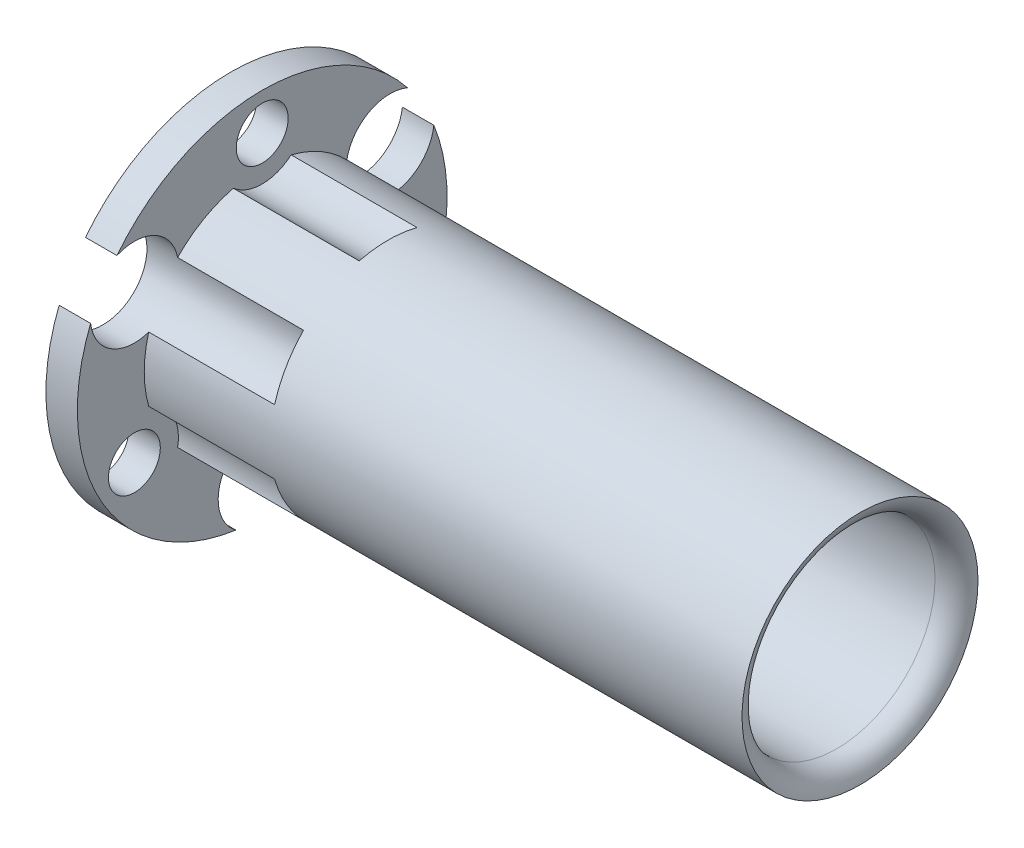
ISO-10303-21;
HEADER;
FILE_DESCRIPTION(('STEP AP214'),'2;1');
FILE_NAME('part.step','',(''),(''),'','','');
FILE_SCHEMA(('AUTOMOTIVE_DESIGN { 1 0 10303 214 1 1 1 1 }'));
ENDSEC;
DATA;
#1=APPLICATION_CONTEXT('core data for automotive mechanical design processes');
#2=APPLICATION_PROTOCOL_DEFINITION('international standard','automotive_design',2000,#1);
#3=PRODUCT_CONTEXT('',#1,'mechanical');
#4=PRODUCT('Part','Part','',(#3));
#5=PRODUCT_RELATED_PRODUCT_CATEGORY('part','',(#4));
#6=PRODUCT_DEFINITION_FORMATION('','',#4);
#7=PRODUCT_DEFINITION_CONTEXT('part definition',#1,'design');
#8=PRODUCT_DEFINITION('design','',#6,#7);
#9=PRODUCT_DEFINITION_SHAPE('','',#8);
#10=(LENGTH_UNIT() NAMED_UNIT(*) SI_UNIT(.MILLI.,.METRE.));
#11=(NAMED_UNIT(*) PLANE_ANGLE_UNIT() SI_UNIT($,.RADIAN.));
#12=(NAMED_UNIT(*) SI_UNIT($,.STERADIAN.) SOLID_ANGLE_UNIT());
#13=UNCERTAINTY_MEASURE_WITH_UNIT(LENGTH_MEASURE(1.E-05),#10,'distance_accuracy_value','');
#14=(GEOMETRIC_REPRESENTATION_CONTEXT(3) GLOBAL_UNCERTAINTY_ASSIGNED_CONTEXT((#13)) GLOBAL_UNIT_ASSIGNED_CONTEXT((#10,
#11,#12)) REPRESENTATION_CONTEXT('',''));
#15=CARTESIAN_POINT('',(0.,0.,0.));
#16=DIRECTION('',(0.,0.,1.));
#17=DIRECTION('',(1.,0.,0.));
#18=AXIS2_PLACEMENT_3D('',#15,#16,#17);
#19=CARTESIAN_POINT('',(2.,0.,0.));
#20=DIRECTION('',(-1.,0.,0.));
#21=DIRECTION('',(0.,0.,1.));
#22=AXIS2_PLACEMENT_3D('',#19,#20,#21);
#23=CYLINDRICAL_SURFACE('',#22,7.5);
#24=CARTESIAN_POINT('',(40.,0.,0.));
#25=DIRECTION('',(1.,0.,0.));
#26=DIRECTION('',(0.,0.,-1.));
#27=AXIS2_PLACEMENT_3D('',#24,#25,#26);
#28=CIRCLE('',#27,7.5);
#29=CARTESIAN_POINT('',(40.,0.,-7.5));
#30=VERTEX_POINT('',#29);
#31=EDGE_CURVE('E265',#30,#30,#28,.T.);
#32=ORIENTED_EDGE('',*,*,#31,.F.);
#33=EDGE_LOOP('',(#32));
#34=FACE_BOUND('',#33,.T.);
#35=DIRECTION('',(-1.,0.,0.));
#36=VECTOR('',#35,1.);
#37=CARTESIAN_POINT('',(6.,-7.27161561001598,1.83673798353818));
#38=LINE('',#37,#36);
#39=CARTESIAN_POINT('',(10.,-7.27161561001598,1.83673798353818));
#40=VERTEX_POINT('',#39);
#41=CARTESIAN_POINT('',(2.,-7.27161561001598,1.83673798353818));
#42=VERTEX_POINT('',#41);
#43=EDGE_CURVE('E171',#40,#42,#38,.T.);
#44=ORIENTED_EDGE('',*,*,#43,.F.);
#45=CARTESIAN_POINT('',(10.,0.,0.));
#46=DIRECTION('',(1.,0.,0.));
#47=DIRECTION('',(0.,0.,-1.));
#48=AXIS2_PLACEMENT_3D('',#45,#46,#47);
#49=CIRCLE('',#48,7.5);
#50=CARTESIAN_POINT('',(10.,-7.27161561001598,-1.83673798353818));
#51=VERTEX_POINT('',#50);
#52=EDGE_CURVE('E51',#40,#51,#49,.T.);
#53=ORIENTED_EDGE('',*,*,#52,.T.);
#54=DIRECTION('',(-1.,0.,0.));
#55=VECTOR('',#54,1.);
#56=CARTESIAN_POINT('',(6.,-7.27161561001598,-1.83673798353818));
#57=LINE('',#56,#55);
#58=CARTESIAN_POINT('',(2.,-7.27161561001598,-1.83673798353818));
#59=VERTEX_POINT('',#58);
#60=EDGE_CURVE('E182',#59,#51,#57,.F.);
#61=ORIENTED_EDGE('',*,*,#60,.F.);
#62=CARTESIAN_POINT('',(2.,0.,0.));
#63=DIRECTION('',(1.,0.,0.));
#64=DIRECTION('',(0.,0.,-1.));
#65=AXIS2_PLACEMENT_3D('',#62,#63,#64);
#66=CIRCLE('',#65,7.5);
#67=CARTESIAN_POINT('',(2.,-5.22646955884792,-5.37903485306017));
#68=VERTEX_POINT('',#67);
#69=EDGE_CURVE('E269',#68,#59,#66,.F.);
#70=ORIENTED_EDGE('',*,*,#69,.F.);
#71=DIRECTION('',(-1.,0.,0.));
#72=VECTOR('',#71,1.);
#73=CARTESIAN_POINT('',(10.,-5.22646955884792,-5.37903485306017));
#74=LINE('',#73,#72);
#75=CARTESIAN_POINT('',(10.,-5.22646955884792,-5.37903485306017));
#76=VERTEX_POINT('',#75);
#77=EDGE_CURVE('E290',#76,#68,#74,.T.);
#78=ORIENTED_EDGE('',*,*,#77,.F.);
#79=CARTESIAN_POINT('',(10.,0.,0.));
#80=DIRECTION('',(1.,0.,0.));
#81=DIRECTION('',(0.,0.,-1.));
#82=AXIS2_PLACEMENT_3D('',#79,#80,#81);
#83=CIRCLE('',#82,7.5);
#84=CARTESIAN_POINT('',(10.,-2.04514605116821,-7.21577283659838));
#85=VERTEX_POINT('',#84);
#86=EDGE_CURVE('E295',#76,#85,#83,.T.);
#87=ORIENTED_EDGE('',*,*,#86,.T.);
#88=DIRECTION('',(-1.,0.,0.));
#89=VECTOR('',#88,1.);
#90=CARTESIAN_POINT('',(10.,-2.04514605116821,-7.21577283659838));
#91=LINE('',#90,#89);
#92=CARTESIAN_POINT('',(2.,-2.04514605116821,-7.21577283659838));
#93=VERTEX_POINT('',#92);
#94=EDGE_CURVE('E298',#85,#93,#91,.T.);
#95=ORIENTED_EDGE('',*,*,#94,.T.);
#96=CARTESIAN_POINT('',(2.,2.04514605116806,-7.21577283659843));
#97=VERTEX_POINT('',#96);
#98=EDGE_CURVE('E325',#97,#93,#66,.F.);
#99=ORIENTED_EDGE('',*,*,#98,.F.);
#100=DIRECTION('',(-1.,0.,0.));
#101=VECTOR('',#100,1.);
#102=CARTESIAN_POINT('',(10.,2.04514605116806,-7.21577283659843));
#103=LINE('',#102,#101);
#104=CARTESIAN_POINT('',(10.,2.04514605116806,-7.21577283659843));
#105=VERTEX_POINT('',#104);
#106=EDGE_CURVE('E300',#105,#97,#103,.T.);
#107=ORIENTED_EDGE('',*,*,#106,.F.);
#108=CARTESIAN_POINT('',(10.,0.,0.));
#109=DIRECTION('',(1.,0.,0.));
#110=DIRECTION('',(0.,0.,-1.));
#111=AXIS2_PLACEMENT_3D('',#108,#109,#110);
#112=CIRCLE('',#111,7.5);
#113=CARTESIAN_POINT('',(10.,5.22646955884781,-5.37903485306028));
#114=VERTEX_POINT('',#113);
#115=EDGE_CURVE('E307',#105,#114,#112,.T.);
#116=ORIENTED_EDGE('',*,*,#115,.T.);
#117=DIRECTION('',(-1.,0.,0.));
#118=VECTOR('',#117,1.);
#119=CARTESIAN_POINT('',(10.,5.22646955884781,-5.37903485306028));
#120=LINE('',#119,#118);
#121=CARTESIAN_POINT('',(2.,5.22646955884781,-5.37903485306028));
#122=VERTEX_POINT('',#121);
#123=EDGE_CURVE('E311',#114,#122,#120,.T.);
#124=ORIENTED_EDGE('',*,*,#123,.T.);
#125=CARTESIAN_POINT('',(2.,7.27161561001597,-1.83673798353823));
#126=VERTEX_POINT('',#125);
#127=EDGE_CURVE('E192',#126,#122,#66,.F.);
#128=ORIENTED_EDGE('',*,*,#127,.F.);
#129=DIRECTION('',(-1.,0.,0.));
#130=VECTOR('',#129,1.);
#131=CARTESIAN_POINT('',(10.,7.27161561001597,-1.83673798353823));
#132=LINE('',#131,#130);
#133=CARTESIAN_POINT('',(10.,7.27161561001597,-1.83673798353823));
#134=VERTEX_POINT('',#133);
#135=EDGE_CURVE('E308',#134,#126,#132,.T.);
#136=ORIENTED_EDGE('',*,*,#135,.F.);
#137=CARTESIAN_POINT('',(10.,0.,0.));
#138=DIRECTION('',(1.,0.,0.));
#139=DIRECTION('',(0.,0.,-1.));
#140=AXIS2_PLACEMENT_3D('',#137,#138,#139);
#141=CIRCLE('',#140,7.5);
#142=CARTESIAN_POINT('',(10.,7.271615610016,1.83673798353813));
#143=VERTEX_POINT('',#142);
#144=EDGE_CURVE('E317',#134,#143,#141,.T.);
#145=ORIENTED_EDGE('',*,*,#144,.T.);
#146=DIRECTION('',(-1.,0.,0.));
#147=VECTOR('',#146,1.);
#148=CARTESIAN_POINT('',(10.,7.271615610016,1.83673798353813));
#149=LINE('',#148,#147);
#150=CARTESIAN_POINT('',(2.,7.271615610016,1.83673798353813));
#151=VERTEX_POINT('',#150);
#152=EDGE_CURVE('E320',#143,#151,#149,.T.);
#153=ORIENTED_EDGE('',*,*,#152,.T.);
#154=CARTESIAN_POINT('',(2.,5.22646955884788,5.37903485306021));
#155=VERTEX_POINT('',#154);
#156=EDGE_CURVE('E191',#155,#151,#66,.F.);
#157=ORIENTED_EDGE('',*,*,#156,.F.);
#158=DIRECTION('',(-1.,0.,0.));
#159=VECTOR('',#158,1.);
#160=CARTESIAN_POINT('',(10.,5.22646955884788,5.37903485306021));
#161=LINE('',#160,#159);
#162=CARTESIAN_POINT('',(10.,5.22646955884788,5.37903485306021));
#163=VERTEX_POINT('',#162);
#164=EDGE_CURVE('E281',#163,#155,#161,.T.);
#165=ORIENTED_EDGE('',*,*,#164,.F.);
#166=CARTESIAN_POINT('',(10.,0.,0.));
#167=DIRECTION('',(1.,0.,0.));
#168=DIRECTION('',(0.,0.,-1.));
#169=AXIS2_PLACEMENT_3D('',#166,#167,#168);
#170=CIRCLE('',#169,7.5);
#171=CARTESIAN_POINT('',(10.,2.04514605116816,7.2157728365984));
#172=VERTEX_POINT('',#171);
#173=EDGE_CURVE('E276',#163,#172,#170,.T.);
#174=ORIENTED_EDGE('',*,*,#173,.T.);
#175=DIRECTION('',(-1.,0.,0.));
#176=VECTOR('',#175,1.);
#177=CARTESIAN_POINT('',(10.,2.04514605116816,7.2157728365984));
#178=LINE('',#177,#176);
#179=CARTESIAN_POINT('',(2.,2.04514605116816,7.2157728365984));
#180=VERTEX_POINT('',#179);
#181=EDGE_CURVE('E279',#172,#180,#178,.T.);
#182=ORIENTED_EDGE('',*,*,#181,.T.);
#183=CARTESIAN_POINT('',(2.,-2.04514605116801,7.21577283659844));
#184=VERTEX_POINT('',#183);
#185=EDGE_CURVE('E189',#184,#180,#66,.F.);
#186=ORIENTED_EDGE('',*,*,#185,.F.);
#187=DIRECTION('',(-1.,0.,0.));
#188=VECTOR('',#187,1.);
#189=CARTESIAN_POINT('',(10.,-2.045146051168,7.21577283659844));
#190=LINE('',#189,#188);
#191=CARTESIAN_POINT('',(10.,-2.045146051168,7.21577283659844));
#192=VERTEX_POINT('',#191);
#193=EDGE_CURVE('E266',#192,#184,#190,.T.);
#194=ORIENTED_EDGE('',*,*,#193,.F.);
#195=CARTESIAN_POINT('',(10.,0.,0.));
#196=DIRECTION('',(1.,0.,0.));
#197=DIRECTION('',(0.,0.,-1.));
#198=AXIS2_PLACEMENT_3D('',#195,#196,#197);
#199=CIRCLE('',#198,7.5);
#200=CARTESIAN_POINT('',(10.,-5.22646955884777,5.37903485306032));
#201=VERTEX_POINT('',#200);
#202=EDGE_CURVE('E287',#192,#201,#199,.T.);
#203=ORIENTED_EDGE('',*,*,#202,.T.);
#204=DIRECTION('',(-1.,0.,0.));
#205=VECTOR('',#204,1.);
#206=CARTESIAN_POINT('',(10.,-5.22646955884777,5.37903485306032));
#207=LINE('',#206,#205);
#208=CARTESIAN_POINT('',(2.,-5.22646955884777,5.37903485306032));
#209=VERTEX_POINT('',#208);
#210=EDGE_CURVE('E187',#201,#209,#207,.T.);
#211=ORIENTED_EDGE('',*,*,#210,.T.);
#212=EDGE_CURVE('E185',#42,#209,#66,.F.);
#213=ORIENTED_EDGE('',*,*,#212,.F.);
#214=EDGE_LOOP('',(#44,#53,#61,#70,#78,#87,#95,#99,#107,#116,#124,#128,#136,#145,#153,#157,#165,
#174,#182,#186,#194,#203,#211,#213));
#215=FACE_BOUND('',#214,.T.);
#216=ADVANCED_FACE('F43',(#34,#215),#23,.T.);
#217=CARTESIAN_POINT('',(2.,0.,0.));
#218=DIRECTION('',(1.,0.,0.));
#219=DIRECTION('',(0.,0.,-1.));
#220=AXIS2_PLACEMENT_3D('',#217,#218,#219);
#221=PLANE('',#220);
#222=CARTESIAN_POINT('',(2.,-4.6925,8.12764841451695));
#223=DIRECTION('',(1.,0.,0.));
#224=DIRECTION('',(0.,0.,-1.));
#225=AXIS2_PLACEMENT_3D('',#222,#223,#224);
#226=CIRCLE('',#225,1.65);
#227=CARTESIAN_POINT('',(2.,-4.6925,6.47764841451695));
#228=VERTEX_POINT('',#227);
#229=EDGE_CURVE('E211',#228,#228,#226,.T.);
#230=ORIENTED_EDGE('',*,*,#229,.F.);
#231=EDGE_LOOP('',(#230));
#232=FACE_BOUND('',#231,.T.);
#233=CARTESIAN_POINT('',(2.,-9.385,0.));
#234=DIRECTION('',(1.,0.,0.));
#235=DIRECTION('',(0.,0.,-1.));
#236=AXIS2_PLACEMENT_3D('',#233,#234,#235);
#237=CIRCLE('',#236,2.8);
#238=CARTESIAN_POINT('',(2.,-11.630299680341,1.6729104415541));
#239=VERTEX_POINT('',#238);
#240=EDGE_CURVE('E177',#42,#239,#237,.T.);
#241=ORIENTED_EDGE('',*,*,#240,.F.);
#242=ORIENTED_EDGE('',*,*,#212,.T.);
#243=CARTESIAN_POINT('',(2.,-4.69249999999986,8.12764841451703));
#244=DIRECTION('',(1.,0.,0.));
#245=DIRECTION('',(0.,0.,-1.));
#246=AXIS2_PLACEMENT_3D('',#243,#244,#245);
#247=CIRCLE('',#246,2.8);
#248=EDGE_CURVE('E66',#209,#184,#247,.T.);
#249=ORIENTED_EDGE('',*,*,#248,.T.);
#250=ORIENTED_EDGE('',*,*,#185,.T.);
#251=CARTESIAN_POINT('',(2.,4.69250000000004,8.12764841451694));
#252=DIRECTION('',(1.,0.,0.));
#253=DIRECTION('',(0.,0.,-1.));
#254=AXIS2_PLACEMENT_3D('',#251,#252,#253);
#255=CIRCLE('',#254,2.8);
#256=CARTESIAN_POINT('',(2.,4.36636689952844,10.9085901975783));
#257=VERTEX_POINT('',#256);
#258=EDGE_CURVE('E203',#257,#180,#255,.T.);
#259=ORIENTED_EDGE('',*,*,#258,.F.);
#260=CARTESIAN_POINT('',(2.,0.,0.));
#261=DIRECTION('',(1.,0.,0.));
#262=DIRECTION('',(0.,0.,-1.));
#263=AXIS2_PLACEMENT_3D('',#260,#261,#262);
#264=CIRCLE('',#263,11.75);
#265=EDGE_CURVE('E196',#257,#239,#264,.T.);
#266=ORIENTED_EDGE('',*,*,#265,.T.);
#267=EDGE_LOOP('',(#241,#242,#249,#250,#259,#266));
#268=FACE_BOUND('',#267,.T.);
#269=ADVANCED_FACE('F193',(#232,#268),#221,.T.);
#270=CARTESIAN_POINT('',(2.,9.385,0.));
#271=DIRECTION('',(1.,0.,0.));
#272=DIRECTION('',(0.,0.,-1.));
#273=AXIS2_PLACEMENT_3D('',#270,#271,#272);
#274=CIRCLE('',#273,1.65);
#275=CARTESIAN_POINT('',(2.,9.385,-1.65));
#276=VERTEX_POINT('',#275);
#277=EDGE_CURVE('E217',#276,#276,#274,.T.);
#278=ORIENTED_EDGE('',*,*,#277,.F.);
#279=EDGE_LOOP('',(#278));
#280=FACE_BOUND('',#279,.T.);
#281=CARTESIAN_POINT('',(2.,4.69250000000004,8.12764841451694));
#282=DIRECTION('',(1.,0.,0.));
#283=DIRECTION('',(0.,0.,-1.));
#284=AXIS2_PLACEMENT_3D('',#281,#282,#283);
#285=CIRCLE('',#284,2.8);
#286=CARTESIAN_POINT('',(2.,7.26393278081262,9.23567975602423));
#287=VERTEX_POINT('',#286);
#288=EDGE_CURVE('E331',#155,#287,#285,.T.);
#289=ORIENTED_EDGE('',*,*,#288,.F.);
#290=ORIENTED_EDGE('',*,*,#156,.T.);
#291=CARTESIAN_POINT('',(2.,9.385,0.));
#292=DIRECTION('',(1.,0.,0.));
#293=DIRECTION('',(0.,0.,-1.));
#294=AXIS2_PLACEMENT_3D('',#291,#292,#293);
#295=CIRCLE('',#294,2.8);
#296=EDGE_CURVE('E283',#151,#126,#295,.T.);
#297=ORIENTED_EDGE('',*,*,#296,.T.);
#298=ORIENTED_EDGE('',*,*,#127,.T.);
#299=CARTESIAN_POINT('',(2.,4.69249999999993,-8.127648414517));
#300=DIRECTION('',(1.,0.,0.));
#301=DIRECTION('',(0.,0.,-1.));
#302=AXIS2_PLACEMENT_3D('',#299,#300,#301);
#303=CIRCLE('',#302,2.8);
#304=CARTESIAN_POINT('',(2.,7.26393278081249,-9.23567975602434));
#305=VERTEX_POINT('',#304);
#306=EDGE_CURVE('E248',#305,#122,#303,.T.);
#307=ORIENTED_EDGE('',*,*,#306,.F.);
#308=CARTESIAN_POINT('',(2.,0.,0.));
#309=DIRECTION('',(1.,0.,0.));
#310=DIRECTION('',(0.,0.,-1.));
#311=AXIS2_PLACEMENT_3D('',#308,#309,#310);
#312=CIRCLE('',#311,11.75);
#313=EDGE_CURVE('E329',#305,#287,#312,.T.);
#314=ORIENTED_EDGE('',*,*,#313,.T.);
#315=EDGE_LOOP('',(#289,#290,#297,#298,#307,#314));
#316=FACE_BOUND('',#315,.T.);
#317=ADVANCED_FACE('F381',(#280,#316),#221,.T.);
#318=CARTESIAN_POINT('',(2.,-4.6925,-8.12764841451696));
#319=DIRECTION('',(1.,0.,0.));
#320=DIRECTION('',(0.,0.,-1.));
#321=AXIS2_PLACEMENT_3D('',#318,#319,#320);
#322=CIRCLE('',#321,1.65);
#323=CARTESIAN_POINT('',(2.,-4.6925,-9.77764841451696));
#324=VERTEX_POINT('',#323);
#325=EDGE_CURVE('E214',#324,#324,#322,.T.);
#326=ORIENTED_EDGE('',*,*,#325,.F.);
#327=EDGE_LOOP('',(#326));
#328=FACE_BOUND('',#327,.T.);
#329=CARTESIAN_POINT('',(2.,4.69249999999993,-8.127648414517));
#330=DIRECTION('',(1.,0.,0.));
#331=DIRECTION('',(0.,0.,-1.));
#332=AXIS2_PLACEMENT_3D('',#329,#330,#331);
#333=CIRCLE('',#332,2.8);
#334=CARTESIAN_POINT('',(2.,4.36636689952829,-10.9085901975784));
#335=VERTEX_POINT('',#334);
#336=EDGE_CURVE('E208',#97,#335,#333,.T.);
#337=ORIENTED_EDGE('',*,*,#336,.F.);
#338=ORIENTED_EDGE('',*,*,#98,.T.);
#339=CARTESIAN_POINT('',(2.,-4.69250000000009,-8.1276484145169));
#340=DIRECTION('',(1.,0.,0.));
#341=DIRECTION('',(0.,0.,-1.));
#342=AXIS2_PLACEMENT_3D('',#339,#340,#341);
#343=CIRCLE('',#342,2.8);
#344=EDGE_CURVE('E58',#93,#68,#343,.T.);
#345=ORIENTED_EDGE('',*,*,#344,.T.);
#346=ORIENTED_EDGE('',*,*,#69,.T.);
#347=CARTESIAN_POINT('',(2.,-9.385,0.));
#348=DIRECTION('',(1.,0.,0.));
#349=DIRECTION('',(0.,0.,-1.));
#350=AXIS2_PLACEMENT_3D('',#347,#348,#349);
#351=CIRCLE('',#350,2.8);
#352=CARTESIAN_POINT('',(2.,-11.630299680341,-1.6729104415541));
#353=VERTEX_POINT('',#352);
#354=EDGE_CURVE('E198',#353,#59,#351,.T.);
#355=ORIENTED_EDGE('',*,*,#354,.F.);
#356=CARTESIAN_POINT('',(2.,0.,0.));
#357=DIRECTION('',(1.,0.,0.));
#358=DIRECTION('',(0.,0.,-1.));
#359=AXIS2_PLACEMENT_3D('',#356,#357,#358);
#360=CIRCLE('',#359,11.75);
#361=EDGE_CURVE('E201',#353,#335,#360,.T.);
#362=ORIENTED_EDGE('',*,*,#361,.T.);
#363=EDGE_LOOP('',(#337,#338,#345,#346,#355,#362));
#364=FACE_BOUND('',#363,.T.);
#365=ADVANCED_FACE('F344',(#328,#364),#221,.T.);
#366=CARTESIAN_POINT('',(2.,0.,0.));
#367=DIRECTION('',(-1.,0.,0.));
#368=DIRECTION('',(0.,0.,1.));
#369=AXIS2_PLACEMENT_3D('',#366,#367,#368);
#370=CYLINDRICAL_SURFACE('',#369,11.75);
#371=CARTESIAN_POINT('',(0.,0.,0.));
#372=DIRECTION('',(1.,0.,0.));
#373=DIRECTION('',(0.,0.,-1.));
#374=AXIS2_PLACEMENT_3D('',#371,#372,#373);
#375=CIRCLE('',#374,11.75);
#376=CARTESIAN_POINT('',(0.,7.26393278081249,-9.23567975602434));
#377=VERTEX_POINT('',#376);
#378=CARTESIAN_POINT('',(0.,7.26393278081262,9.23567975602423));
#379=VERTEX_POINT('',#378);
#380=EDGE_CURVE('E188',#377,#379,#375,.T.);
#381=ORIENTED_EDGE('',*,*,#380,.T.);
#382=DIRECTION('',(-1.,0.,0.));
#383=VECTOR('',#382,1.);
#384=CARTESIAN_POINT('',(2.,7.26393278081262,9.23567975602423));
#385=LINE('',#384,#383);
#386=EDGE_CURVE('E256',#287,#379,#385,.T.);
#387=ORIENTED_EDGE('',*,*,#386,.F.);
#388=ORIENTED_EDGE('',*,*,#313,.F.);
#389=DIRECTION('',(-1.,0.,0.));
#390=VECTOR('',#389,1.);
#391=CARTESIAN_POINT('',(2.,7.26393278081249,-9.23567975602434));
#392=LINE('',#391,#390);
#393=EDGE_CURVE('E259',#305,#377,#392,.T.);
#394=ORIENTED_EDGE('',*,*,#393,.T.);
#395=EDGE_LOOP('',(#381,#387,#388,#394));
#396=FACE_BOUND('',#395,.T.);
#397=ADVANCED_FACE('F401',(#396),#370,.T.);
#398=CARTESIAN_POINT('',(2.,4.69250000000004,8.12764841451694));
#399=DIRECTION('',(-1.,0.,0.));
#400=DIRECTION('',(0.,0.,1.));
#401=AXIS2_PLACEMENT_3D('',#398,#399,#400);
#402=CYLINDRICAL_SURFACE('',#401,2.8);
#403=CARTESIAN_POINT('',(0.,4.69250000000004,8.12764841451694));
#404=DIRECTION('',(1.,0.,0.));
#405=DIRECTION('',(0.,0.,-1.));
#406=AXIS2_PLACEMENT_3D('',#403,#404,#405);
#407=CIRCLE('',#406,2.8);
#408=CARTESIAN_POINT('',(0.,4.36636689952844,10.9085901975783));
#409=VERTEX_POINT('',#408);
#410=EDGE_CURVE('E223',#409,#379,#407,.T.);
#411=ORIENTED_EDGE('',*,*,#410,.F.);
#412=DIRECTION('',(-1.,0.,0.));
#413=VECTOR('',#412,1.);
#414=CARTESIAN_POINT('',(2.,4.36636689952844,10.9085901975783));
#415=LINE('',#414,#413);
#416=EDGE_CURVE('E254',#257,#409,#415,.T.);
#417=ORIENTED_EDGE('',*,*,#416,.F.);
#418=ORIENTED_EDGE('',*,*,#258,.T.);
#419=ORIENTED_EDGE('',*,*,#181,.F.);
#420=CARTESIAN_POINT('',(10.,4.69250000000004,8.12764841451694));
#421=DIRECTION('',(1.,0.,0.));
#422=DIRECTION('',(0.,0.,-1.));
#423=AXIS2_PLACEMENT_3D('',#420,#421,#422);
#424=CIRCLE('',#423,2.8);
#425=EDGE_CURVE('E273',#172,#163,#424,.T.);
#426=ORIENTED_EDGE('',*,*,#425,.T.);
#427=ORIENTED_EDGE('',*,*,#164,.T.);
#428=ORIENTED_EDGE('',*,*,#288,.T.);
#429=ORIENTED_EDGE('',*,*,#386,.T.);
#430=EDGE_LOOP('',(#411,#417,#418,#419,#426,#427,#428,#429));
#431=FACE_BOUND('',#430,.T.);
#432=ADVANCED_FACE('F336',(#431),#402,.F.);
#433=CARTESIAN_POINT('',(2.,0.,0.));
#434=DIRECTION('',(-1.,0.,0.));
#435=DIRECTION('',(0.,0.,1.));
#436=AXIS2_PLACEMENT_3D('',#433,#434,#435);
#437=CYLINDRICAL_SURFACE('',#436,11.75);
#438=CARTESIAN_POINT('',(0.,0.,0.));
#439=DIRECTION('',(1.,0.,0.));
#440=DIRECTION('',(0.,0.,-1.));
#441=AXIS2_PLACEMENT_3D('',#438,#439,#440);
#442=CIRCLE('',#441,11.75);
#443=CARTESIAN_POINT('',(0.,-11.630299680341,1.6729104415541));
#444=VERTEX_POINT('',#443);
#445=EDGE_CURVE('E225',#409,#444,#442,.T.);
#446=ORIENTED_EDGE('',*,*,#445,.T.);
#447=DIRECTION('',(-1.,0.,0.));
#448=VECTOR('',#447,1.);
#449=CARTESIAN_POINT('',(2.,-11.630299680341,1.6729104415541));
#450=LINE('',#449,#448);
#451=EDGE_CURVE('E252',#239,#444,#450,.T.);
#452=ORIENTED_EDGE('',*,*,#451,.F.);
#453=ORIENTED_EDGE('',*,*,#265,.F.);
#454=ORIENTED_EDGE('',*,*,#416,.T.);
#455=EDGE_LOOP('',(#446,#452,#453,#454));
#456=FACE_BOUND('',#455,.T.);
#457=ADVANCED_FACE('F396',(#456),#437,.T.);
#458=CARTESIAN_POINT('',(2.,-9.385,0.));
#459=DIRECTION('',(-1.,0.,0.));
#460=DIRECTION('',(0.,0.,1.));
#461=AXIS2_PLACEMENT_3D('',#458,#459,#460);
#462=CYLINDRICAL_SURFACE('',#461,2.8);
#463=CARTESIAN_POINT('',(0.,-9.385,0.));
#464=DIRECTION('',(1.,0.,0.));
#465=DIRECTION('',(0.,0.,-1.));
#466=AXIS2_PLACEMENT_3D('',#463,#464,#465);
#467=CIRCLE('',#466,2.8);
#468=CARTESIAN_POINT('',(0.,-11.630299680341,-1.6729104415541));
#469=VERTEX_POINT('',#468);
#470=EDGE_CURVE('E228',#469,#444,#467,.T.);
#471=ORIENTED_EDGE('',*,*,#470,.F.);
#472=DIRECTION('',(-1.,0.,0.));
#473=VECTOR('',#472,1.);
#474=CARTESIAN_POINT('',(2.,-11.630299680341,-1.6729104415541));
#475=LINE('',#474,#473);
#476=EDGE_CURVE('E250',#353,#469,#475,.T.);
#477=ORIENTED_EDGE('',*,*,#476,.F.);
#478=ORIENTED_EDGE('',*,*,#354,.T.);
#479=ORIENTED_EDGE('',*,*,#60,.T.);
#480=CARTESIAN_POINT('',(10.,-9.385,0.));
#481=DIRECTION('',(1.,0.,0.));
#482=DIRECTION('',(0.,0.,-1.));
#483=AXIS2_PLACEMENT_3D('',#480,#481,#482);
#484=CIRCLE('',#483,2.8);
#485=EDGE_CURVE('E179',#51,#40,#484,.T.);
#486=ORIENTED_EDGE('',*,*,#485,.T.);
#487=ORIENTED_EDGE('',*,*,#43,.T.);
#488=ORIENTED_EDGE('',*,*,#240,.T.);
#489=ORIENTED_EDGE('',*,*,#451,.T.);
#490=EDGE_LOOP('',(#471,#477,#478,#479,#486,#487,#488,#489));
#491=FACE_BOUND('',#490,.T.);
#492=ADVANCED_FACE('F174',(#491),#462,.F.);
#493=CARTESIAN_POINT('',(2.,0.,0.));
#494=DIRECTION('',(-1.,0.,0.));
#495=DIRECTION('',(0.,0.,1.));
#496=AXIS2_PLACEMENT_3D('',#493,#494,#495);
#497=CYLINDRICAL_SURFACE('',#496,11.75);
#498=CARTESIAN_POINT('',(0.,0.,0.));
#499=DIRECTION('',(1.,0.,0.));
#500=DIRECTION('',(0.,0.,-1.));
#501=AXIS2_PLACEMENT_3D('',#498,#499,#500);
#502=CIRCLE('',#501,11.75);
#503=CARTESIAN_POINT('',(0.,4.36636689952829,-10.9085901975784));
#504=VERTEX_POINT('',#503);
#505=EDGE_CURVE('E230',#469,#504,#502,.T.);
#506=ORIENTED_EDGE('',*,*,#505,.T.);
#507=DIRECTION('',(-1.,0.,0.));
#508=VECTOR('',#507,1.);
#509=CARTESIAN_POINT('',(2.,4.36636689952829,-10.9085901975784));
#510=LINE('',#509,#508);
#511=EDGE_CURVE('E220',#335,#504,#510,.T.);
#512=ORIENTED_EDGE('',*,*,#511,.F.);
#513=ORIENTED_EDGE('',*,*,#361,.F.);
#514=ORIENTED_EDGE('',*,*,#476,.T.);
#515=EDGE_LOOP('',(#506,#512,#513,#514));
#516=FACE_BOUND('',#515,.T.);
#517=ADVANCED_FACE('F350',(#516),#497,.T.);
#518=CARTESIAN_POINT('',(2.,4.69249999999993,-8.127648414517));
#519=DIRECTION('',(-1.,0.,0.));
#520=DIRECTION('',(0.,0.,1.));
#521=AXIS2_PLACEMENT_3D('',#518,#519,#520);
#522=CYLINDRICAL_SURFACE('',#521,2.8);
#523=CARTESIAN_POINT('',(0.,4.69249999999993,-8.127648414517));
#524=DIRECTION('',(1.,0.,0.));
#525=DIRECTION('',(0.,0.,-1.));
#526=AXIS2_PLACEMENT_3D('',#523,#524,#525);
#527=CIRCLE('',#526,2.8);
#528=EDGE_CURVE('E233',#377,#504,#527,.T.);
#529=ORIENTED_EDGE('',*,*,#528,.F.);
#530=ORIENTED_EDGE('',*,*,#393,.F.);
#531=ORIENTED_EDGE('',*,*,#306,.T.);
#532=ORIENTED_EDGE('',*,*,#123,.F.);
#533=CARTESIAN_POINT('',(10.,4.69249999999993,-8.127648414517));
#534=DIRECTION('',(1.,0.,0.));
#535=DIRECTION('',(0.,0.,-1.));
#536=AXIS2_PLACEMENT_3D('',#533,#534,#535);
#537=CIRCLE('',#536,2.8);
#538=EDGE_CURVE('E304',#114,#105,#537,.T.);
#539=ORIENTED_EDGE('',*,*,#538,.T.);
#540=ORIENTED_EDGE('',*,*,#106,.T.);
#541=ORIENTED_EDGE('',*,*,#336,.T.);
#542=ORIENTED_EDGE('',*,*,#511,.T.);
#543=EDGE_LOOP('',(#529,#530,#531,#532,#539,#540,#541,#542));
#544=FACE_BOUND('',#543,.T.);
#545=ADVANCED_FACE('F353',(#544),#522,.F.);
#546=CARTESIAN_POINT('',(2.,-4.6925,-8.12764841451696));
#547=DIRECTION('',(-1.,0.,0.));
#548=DIRECTION('',(0.,0.,1.));
#549=AXIS2_PLACEMENT_3D('',#546,#547,#548);
#550=CYLINDRICAL_SURFACE('',#549,1.65);
#551=ORIENTED_EDGE('',*,*,#325,.T.);
#552=EDGE_LOOP('',(#551));
#553=FACE_BOUND('',#552,.T.);
#554=CARTESIAN_POINT('',(0.,-4.6925,-8.12764841451696));
#555=DIRECTION('',(1.,0.,0.));
#556=DIRECTION('',(0.,0.,-1.));
#557=AXIS2_PLACEMENT_3D('',#554,#555,#556);
#558=CIRCLE('',#557,1.65);
#559=CARTESIAN_POINT('',(0.,-4.6925,-9.77764841451696));
#560=VERTEX_POINT('',#559);
#561=EDGE_CURVE('E242',#560,#560,#558,.T.);
#562=ORIENTED_EDGE('',*,*,#561,.F.);
#563=EDGE_LOOP('',(#562));
#564=FACE_BOUND('',#563,.T.);
#565=ADVANCED_FACE('F391',(#553,#564),#550,.F.);
#566=CARTESIAN_POINT('',(2.,-4.6925,8.12764841451695));
#567=DIRECTION('',(-1.,0.,0.));
#568=DIRECTION('',(0.,0.,1.));
#569=AXIS2_PLACEMENT_3D('',#566,#567,#568);
#570=CYLINDRICAL_SURFACE('',#569,1.65);
#571=ORIENTED_EDGE('',*,*,#229,.T.);
#572=EDGE_LOOP('',(#571));
#573=FACE_BOUND('',#572,.T.);
#574=CARTESIAN_POINT('',(0.,-4.6925,8.12764841451695));
#575=DIRECTION('',(1.,0.,0.));
#576=DIRECTION('',(0.,0.,-1.));
#577=AXIS2_PLACEMENT_3D('',#574,#575,#576);
#578=CIRCLE('',#577,1.65);
#579=CARTESIAN_POINT('',(0.,-4.6925,6.47764841451695));
#580=VERTEX_POINT('',#579);
#581=EDGE_CURVE('E239',#580,#580,#578,.T.);
#582=ORIENTED_EDGE('',*,*,#581,.F.);
#583=EDGE_LOOP('',(#582));
#584=FACE_BOUND('',#583,.T.);
#585=ADVANCED_FACE('F445',(#573,#584),#570,.F.);
#586=CARTESIAN_POINT('',(2.,0.,0.));
#587=DIRECTION('',(-1.,0.,0.));
#588=DIRECTION('',(0.,0.,1.));
#589=AXIS2_PLACEMENT_3D('',#586,#587,#588);
#590=CYLINDRICAL_SURFACE('',#589,6.25);
#591=CARTESIAN_POINT('',(38.5209800542251,0.,0.));
#592=DIRECTION('',(1.,0.,0.));
#593=DIRECTION('',(0.,0.,-1.));
#594=AXIS2_PLACEMENT_3D('',#591,#592,#593);
#595=CIRCLE('',#594,6.25);
#596=CARTESIAN_POINT('',(38.5209800542251,0.,-6.25));
#597=VERTEX_POINT('',#596);
#598=EDGE_CURVE('E11',#597,#597,#595,.T.);
#599=ORIENTED_EDGE('',*,*,#598,.T.);
#600=EDGE_LOOP('',(#599));
#601=FACE_BOUND('',#600,.T.);
#602=CARTESIAN_POINT('',(0.,0.,0.));
#603=DIRECTION('',(1.,0.,0.));
#604=DIRECTION('',(0.,0.,-1.));
#605=AXIS2_PLACEMENT_3D('',#602,#603,#604);
#606=CIRCLE('',#605,6.25);
#607=CARTESIAN_POINT('',(0.,0.,-6.25));
#608=VERTEX_POINT('',#607);
#609=EDGE_CURVE('E236',#608,#608,#606,.T.);
#610=ORIENTED_EDGE('',*,*,#609,.F.);
#611=EDGE_LOOP('',(#610));
#612=FACE_BOUND('',#611,.T.);
#613=ADVANCED_FACE('F387',(#601,#612),#590,.F.);
#614=CARTESIAN_POINT('',(2.,9.385,0.));
#615=DIRECTION('',(-1.,0.,0.));
#616=DIRECTION('',(0.,0.,1.));
#617=AXIS2_PLACEMENT_3D('',#614,#615,#616);
#618=CYLINDRICAL_SURFACE('',#617,1.65);
#619=ORIENTED_EDGE('',*,*,#277,.T.);
#620=EDGE_LOOP('',(#619));
#621=FACE_BOUND('',#620,.T.);
#622=CARTESIAN_POINT('',(0.,9.385,0.));
#623=DIRECTION('',(1.,0.,0.));
#624=DIRECTION('',(0.,0.,-1.));
#625=AXIS2_PLACEMENT_3D('',#622,#623,#624);
#626=CIRCLE('',#625,1.65);
#627=CARTESIAN_POINT('',(0.,9.385,-1.65));
#628=VERTEX_POINT('',#627);
#629=EDGE_CURVE('E245',#628,#628,#626,.T.);
#630=ORIENTED_EDGE('',*,*,#629,.F.);
#631=EDGE_LOOP('',(#630));
#632=FACE_BOUND('',#631,.T.);
#633=ADVANCED_FACE('F440',(#621,#632),#618,.F.);
#634=CARTESIAN_POINT('',(0.,0.,0.));
#635=DIRECTION('',(1.,0.,0.));
#636=DIRECTION('',(0.,0.,-1.));
#637=AXIS2_PLACEMENT_3D('',#634,#635,#636);
#638=PLANE('',#637);
#639=ORIENTED_EDGE('',*,*,#470,.T.);
#640=ORIENTED_EDGE('',*,*,#445,.F.);
#641=ORIENTED_EDGE('',*,*,#410,.T.);
#642=ORIENTED_EDGE('',*,*,#380,.F.);
#643=ORIENTED_EDGE('',*,*,#528,.T.);
#644=ORIENTED_EDGE('',*,*,#505,.F.);
#645=EDGE_LOOP('',(#639,#640,#641,#642,#643,#644));
#646=FACE_BOUND('',#645,.T.);
#647=ORIENTED_EDGE('',*,*,#609,.T.);
#648=EDGE_LOOP('',(#647));
#649=FACE_BOUND('',#648,.T.);
#650=ORIENTED_EDGE('',*,*,#561,.T.);
#651=EDGE_LOOP('',(#650));
#652=FACE_BOUND('',#651,.T.);
#653=ORIENTED_EDGE('',*,*,#629,.T.);
#654=EDGE_LOOP('',(#653));
#655=FACE_BOUND('',#654,.T.);
#656=ORIENTED_EDGE('',*,*,#581,.T.);
#657=EDGE_LOOP('',(#656));
#658=FACE_BOUND('',#657,.T.);
#659=ADVANCED_FACE('F412',(#646,#649,#652,#655,#658),#638,.F.);
#660=CARTESIAN_POINT('',(10.,-4.69249999999986,8.12764841451703));
#661=DIRECTION('',(-1.,0.,0.));
#662=DIRECTION('',(0.,0.,1.));
#663=AXIS2_PLACEMENT_3D('',#660,#661,#662);
#664=CYLINDRICAL_SURFACE('',#663,2.8);
#665=ORIENTED_EDGE('',*,*,#248,.F.);
#666=ORIENTED_EDGE('',*,*,#210,.F.);
#667=CARTESIAN_POINT('',(10.,-4.69249999999986,8.12764841451703));
#668=DIRECTION('',(1.,0.,0.));
#669=DIRECTION('',(0.,0.,-1.));
#670=AXIS2_PLACEMENT_3D('',#667,#668,#669);
#671=CIRCLE('',#670,2.8);
#672=EDGE_CURVE('E284',#201,#192,#671,.T.);
#673=ORIENTED_EDGE('',*,*,#672,.T.);
#674=ORIENTED_EDGE('',*,*,#193,.T.);
#675=EDGE_LOOP('',(#665,#666,#673,#674));
#676=FACE_BOUND('',#675,.T.);
#677=ADVANCED_FACE('F439',(#676),#664,.F.);
#678=CARTESIAN_POINT('',(10.,-2.34624999999993,4.06382420725852));
#679=DIRECTION('',(1.,0.,0.));
#680=DIRECTION('',(0.,0.,-1.));
#681=AXIS2_PLACEMENT_3D('',#678,#679,#680);
#682=PLANE('',#681);
#683=ORIENTED_EDGE('',*,*,#672,.F.);
#684=ORIENTED_EDGE('',*,*,#202,.F.);
#685=EDGE_LOOP('',(#683,#684));
#686=FACE_BOUND('',#685,.T.);
#687=ADVANCED_FACE('F371',(#686),#682,.F.);
#688=CARTESIAN_POINT('',(10.,-4.69250000000009,-8.1276484145169));
#689=DIRECTION('',(-1.,0.,0.));
#690=DIRECTION('',(0.,0.,1.));
#691=AXIS2_PLACEMENT_3D('',#688,#689,#690);
#692=CYLINDRICAL_SURFACE('',#691,2.8);
#693=ORIENTED_EDGE('',*,*,#344,.F.);
#694=ORIENTED_EDGE('',*,*,#94,.F.);
#695=CARTESIAN_POINT('',(10.,-4.69250000000009,-8.1276484145169));
#696=DIRECTION('',(1.,0.,0.));
#697=DIRECTION('',(0.,0.,-1.));
#698=AXIS2_PLACEMENT_3D('',#695,#696,#697);
#699=CIRCLE('',#698,2.8);
#700=EDGE_CURVE('E292',#85,#76,#699,.T.);
#701=ORIENTED_EDGE('',*,*,#700,.T.);
#702=ORIENTED_EDGE('',*,*,#77,.T.);
#703=EDGE_LOOP('',(#693,#694,#701,#702));
#704=FACE_BOUND('',#703,.T.);
#705=ADVANCED_FACE('F358',(#704),#692,.F.);
#706=CARTESIAN_POINT('',(10.,-2.34625000000005,-4.06382420725845));
#707=DIRECTION('',(1.,0.,0.));
#708=DIRECTION('',(0.,0.,-1.));
#709=AXIS2_PLACEMENT_3D('',#706,#707,#708);
#710=PLANE('',#709);
#711=ORIENTED_EDGE('',*,*,#700,.F.);
#712=ORIENTED_EDGE('',*,*,#86,.F.);
#713=EDGE_LOOP('',(#711,#712));
#714=FACE_BOUND('',#713,.T.);
#715=ADVANCED_FACE('F360',(#714),#710,.F.);
#716=CARTESIAN_POINT('',(10.,2.34624999999996,-4.0638242072585));
#717=DIRECTION('',(1.,0.,0.));
#718=DIRECTION('',(0.,0.,-1.));
#719=AXIS2_PLACEMENT_3D('',#716,#717,#718);
#720=PLANE('',#719);
#721=ORIENTED_EDGE('',*,*,#538,.F.);
#722=ORIENTED_EDGE('',*,*,#115,.F.);
#723=EDGE_LOOP('',(#721,#722));
#724=FACE_BOUND('',#723,.T.);
#725=ADVANCED_FACE('F362',(#724),#720,.F.);
#726=CARTESIAN_POINT('',(10.,9.385,0.));
#727=DIRECTION('',(-1.,0.,0.));
#728=DIRECTION('',(0.,0.,1.));
#729=AXIS2_PLACEMENT_3D('',#726,#727,#728);
#730=CYLINDRICAL_SURFACE('',#729,2.8);
#731=ORIENTED_EDGE('',*,*,#296,.F.);
#732=ORIENTED_EDGE('',*,*,#152,.F.);
#733=CARTESIAN_POINT('',(10.,9.385,0.));
#734=DIRECTION('',(1.,0.,0.));
#735=DIRECTION('',(0.,0.,-1.));
#736=AXIS2_PLACEMENT_3D('',#733,#734,#735);
#737=CIRCLE('',#736,2.8);
#738=EDGE_CURVE('E314',#143,#134,#737,.T.);
#739=ORIENTED_EDGE('',*,*,#738,.T.);
#740=ORIENTED_EDGE('',*,*,#135,.T.);
#741=EDGE_LOOP('',(#731,#732,#739,#740));
#742=FACE_BOUND('',#741,.T.);
#743=ADVANCED_FACE('F368',(#742),#730,.F.);
#744=CARTESIAN_POINT('',(10.,4.6925,0.));
#745=DIRECTION('',(1.,0.,0.));
#746=DIRECTION('',(0.,0.,-1.));
#747=AXIS2_PLACEMENT_3D('',#744,#745,#746);
#748=PLANE('',#747);
#749=ORIENTED_EDGE('',*,*,#738,.F.);
#750=ORIENTED_EDGE('',*,*,#144,.F.);
#751=EDGE_LOOP('',(#749,#750));
#752=FACE_BOUND('',#751,.T.);
#753=ADVANCED_FACE('F425',(#752),#748,.F.);
#754=CARTESIAN_POINT('',(10.,2.34625000000002,4.06382420725847));
#755=DIRECTION('',(1.,0.,0.));
#756=DIRECTION('',(0.,0.,-1.));
#757=AXIS2_PLACEMENT_3D('',#754,#755,#756);
#758=PLANE('',#757);
#759=ORIENTED_EDGE('',*,*,#425,.F.);
#760=ORIENTED_EDGE('',*,*,#173,.F.);
#761=EDGE_LOOP('',(#759,#760));
#762=FACE_BOUND('',#761,.T.);
#763=ADVANCED_FACE('F427',(#762),#758,.F.);
#764=CARTESIAN_POINT('',(10.,-4.6925,0.));
#765=DIRECTION('',(1.,0.,0.));
#766=DIRECTION('',(0.,0.,-1.));
#767=AXIS2_PLACEMENT_3D('',#764,#765,#766);
#768=PLANE('',#767);
#769=ORIENTED_EDGE('',*,*,#485,.F.);
#770=ORIENTED_EDGE('',*,*,#52,.F.);
#771=EDGE_LOOP('',(#769,#770));
#772=FACE_BOUND('',#771,.T.);
#773=ADVANCED_FACE('F264',(#772),#768,.F.);
#774=CARTESIAN_POINT('',(38.5209800542251,0.,0.));
#775=DIRECTION('',(1.,0.,0.));
#776=DIRECTION('',(0.,0.,-1.));
#777=AXIS2_PLACEMENT_3D('',#774,#775,#776);
#778=TOROIDAL_SURFACE('',#777,7.75,1.5);
#779=ORIENTED_EDGE('',*,*,#31,.T.);
#780=EDGE_LOOP('',(#779));
#781=FACE_BOUND('',#780,.T.);
#782=ORIENTED_EDGE('',*,*,#598,.F.);
#783=EDGE_LOOP('',(#782));
#784=FACE_BOUND('',#783,.T.);
#785=ADVANCED_FACE('F45',(#781,#784),#778,.T.);
#786=CLOSED_SHELL('',(#216,#269,#317,#365,#397,#432,#457,#492,#517,#545,#565,#585,#613,#633,
#659,#677,#687,#705,#715,#725,#743,#753,#763,#773,#785));
#787=MANIFOLD_SOLID_BREP('B2',#786);
#788=ADVANCED_BREP_SHAPE_REPRESENTATION('',(#18,#787),#14);
#789=SHAPE_DEFINITION_REPRESENTATION(#9,#788);
ENDSEC;
END-ISO-10303-21;
